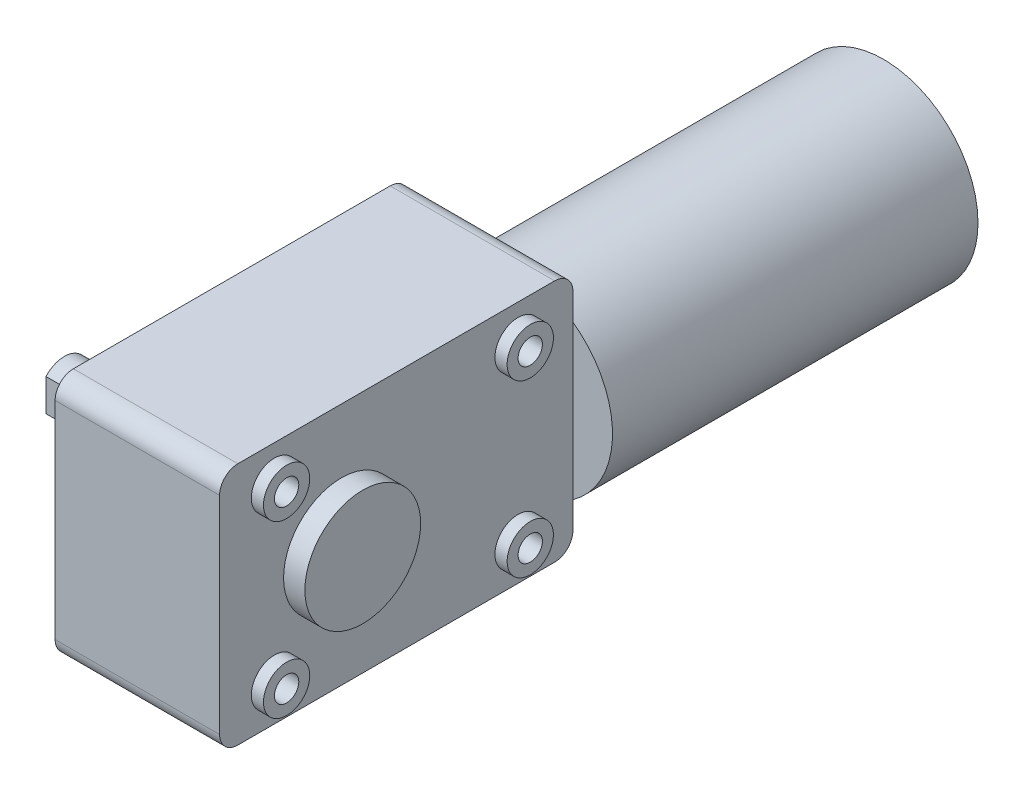
ISO-10303-21;
HEADER;
FILE_DESCRIPTION(('STEP AP214'),'2;1');
FILE_NAME('part.step','',(''),(''),'','','');
FILE_SCHEMA(('AUTOMOTIVE_DESIGN { 1 0 10303 214 1 1 1 1 }'));
ENDSEC;
DATA;
#1=APPLICATION_CONTEXT('core data for automotive mechanical design processes');
#2=APPLICATION_PROTOCOL_DEFINITION('international standard','automotive_design',2000,#1);
#3=PRODUCT_CONTEXT('',#1,'mechanical');
#4=PRODUCT('Part','Part','',(#3));
#5=PRODUCT_RELATED_PRODUCT_CATEGORY('part','',(#4));
#6=PRODUCT_DEFINITION_FORMATION('','',#4);
#7=PRODUCT_DEFINITION_CONTEXT('part definition',#1,'design');
#8=PRODUCT_DEFINITION('design','',#6,#7);
#9=PRODUCT_DEFINITION_SHAPE('','',#8);
#10=(LENGTH_UNIT() NAMED_UNIT(*) SI_UNIT(.MILLI.,.METRE.));
#11=(NAMED_UNIT(*) PLANE_ANGLE_UNIT() SI_UNIT($,.RADIAN.));
#12=(NAMED_UNIT(*) SI_UNIT($,.STERADIAN.) SOLID_ANGLE_UNIT());
#13=UNCERTAINTY_MEASURE_WITH_UNIT(LENGTH_MEASURE(1.E-05),#10,'distance_accuracy_value','');
#14=(GEOMETRIC_REPRESENTATION_CONTEXT(3) GLOBAL_UNCERTAINTY_ASSIGNED_CONTEXT((#13)) GLOBAL_UNIT_ASSIGNED_CONTEXT((#10,
#11,#12)) REPRESENTATION_CONTEXT('',''));
#15=CARTESIAN_POINT('',(0.,0.,0.));
#16=DIRECTION('',(0.,0.,1.));
#17=DIRECTION('',(1.,0.,0.));
#18=AXIS2_PLACEMENT_3D('',#15,#16,#17);
#19=CARTESIAN_POINT('',(11.,-14.,69.));
#20=DIRECTION('',(-1.,0.,0.));
#21=DIRECTION('',(0.,0.,1.));
#22=AXIS2_PLACEMENT_3D('',#19,#20,#21);
#23=PLANE('',#22);
#24=CARTESIAN_POINT('',(11.,-14.,69.));
#25=DIRECTION('',(1.,0.,0.));
#26=DIRECTION('',(0.,0.,1.));
#27=AXIS2_PLACEMENT_3D('',#24,#25,#26);
#28=CIRCLE('',#27,3.8);
#29=CARTESIAN_POINT('',(11.,-14.,72.8));
#30=VERTEX_POINT('',#29);
#31=EDGE_CURVE('E740',#30,#30,#28,.T.);
#32=ORIENTED_EDGE('',*,*,#31,.T.);
#33=EDGE_LOOP('',(#32));
#34=FACE_BOUND('',#33,.T.);
#35=CARTESIAN_POINT('',(11.,-14.,69.));
#36=DIRECTION('',(1.,0.,0.));
#37=DIRECTION('',(0.,0.,-1.));
#38=AXIS2_PLACEMENT_3D('',#35,#36,#37);
#39=CIRCLE('',#38,2.);
#40=CARTESIAN_POINT('',(11.,-14.,67.));
#41=VERTEX_POINT('',#40);
#42=EDGE_CURVE('E721',#41,#41,#39,.T.);
#43=ORIENTED_EDGE('',*,*,#42,.F.);
#44=EDGE_LOOP('',(#43));
#45=FACE_BOUND('',#44,.T.);
#46=ADVANCED_FACE('F50',(#34,#45),#23,.F.);
#47=CARTESIAN_POINT('',(0.,0.,60.));
#48=DIRECTION('',(0.,0.,1.));
#49=DIRECTION('',(1.,0.,0.));
#50=AXIS2_PLACEMENT_3D('',#47,#48,#49);
#51=PLANE('',#50);
#52=CARTESIAN_POINT('',(0.,0.,60.));
#53=DIRECTION('',(0.,0.,1.));
#54=DIRECTION('',(1.,0.,0.));
#55=AXIS2_PLACEMENT_3D('',#52,#53,#54);
#56=CIRCLE('',#55,15.5);
#57=CARTESIAN_POINT('',(9.00000000000001,-12.619429464124,60.));
#58=VERTEX_POINT('',#57);
#59=CARTESIAN_POINT('',(9.00000000000001,12.619429464124,60.));
#60=VERTEX_POINT('',#59);
#61=EDGE_CURVE('E205',#58,#60,#56,.T.);
#62=ORIENTED_EDGE('',*,*,#61,.T.);
#63=DIRECTION('',(0.,-1.,0.));
#64=VECTOR('',#63,1.);
#65=CARTESIAN_POINT('',(9.00000000000001,20.,60.));
#66=LINE('',#65,#64);
#67=EDGE_CURVE('E195',#60,#58,#66,.T.);
#68=ORIENTED_EDGE('',*,*,#67,.T.);
#69=EDGE_LOOP('',(#62,#68));
#70=FACE_BOUND('',#69,.T.);
#71=ADVANCED_FACE('F296',(#70),#51,.T.);
#72=CARTESIAN_POINT('',(0.,0.,60.));
#73=DIRECTION('',(0.,0.,-1.));
#74=DIRECTION('',(-1.,0.,0.));
#75=AXIS2_PLACEMENT_3D('',#72,#73,#74);
#76=CYLINDRICAL_SURFACE('',#75,15.5);
#77=EDGE_CURVE('E202',#60,#58,#56,.T.);
#78=ORIENTED_EDGE('',*,*,#77,.F.);
#79=ORIENTED_EDGE('',*,*,#61,.F.);
#80=EDGE_LOOP('',(#78,#79));
#81=FACE_BOUND('',#80,.T.);
#82=CARTESIAN_POINT('',(0.,0.,0.));
#83=DIRECTION('',(0.,0.,1.));
#84=DIRECTION('',(1.,0.,0.));
#85=AXIS2_PLACEMENT_3D('',#82,#83,#84);
#86=CIRCLE('',#85,15.5);
#87=CARTESIAN_POINT('',(15.5,0.,0.));
#88=VERTEX_POINT('',#87);
#89=EDGE_CURVE('E198',#88,#88,#86,.T.);
#90=ORIENTED_EDGE('',*,*,#89,.T.);
#91=EDGE_LOOP('',(#90));
#92=FACE_BOUND('',#91,.T.);
#93=ADVANCED_FACE('F298',(#81,#92),#76,.T.);
#94=CARTESIAN_POINT('',(0.,0.,0.));
#95=DIRECTION('',(0.,0.,1.));
#96=DIRECTION('',(1.,0.,0.));
#97=AXIS2_PLACEMENT_3D('',#94,#95,#96);
#98=PLANE('',#97);
#99=CARTESIAN_POINT('',(0.,0.,0.));
#100=DIRECTION('',(0.,0.,-1.));
#101=DIRECTION('',(-1.,0.,0.));
#102=AXIS2_PLACEMENT_3D('',#99,#100,#101);
#103=CIRCLE('',#102,6.);
#104=CARTESIAN_POINT('',(-6.,0.,0.));
#105=VERTEX_POINT('',#104);
#106=EDGE_CURVE('E199',#105,#105,#103,.T.);
#107=ORIENTED_EDGE('',*,*,#106,.F.);
#108=EDGE_LOOP('',(#107));
#109=FACE_BOUND('',#108,.T.);
#110=ORIENTED_EDGE('',*,*,#89,.F.);
#111=EDGE_LOOP('',(#110));
#112=FACE_BOUND('',#111,.T.);
#113=ADVANCED_FACE('F301',(#109,#112),#98,.F.);
#114=CARTESIAN_POINT('',(0.,0.,-2.));
#115=DIRECTION('',(0.,0.,1.));
#116=DIRECTION('',(1.,0.,0.));
#117=AXIS2_PLACEMENT_3D('',#114,#115,#116);
#118=CYLINDRICAL_SURFACE('',#117,6.);
#119=CARTESIAN_POINT('',(0.,0.,-2.));
#120=DIRECTION('',(0.,0.,-1.));
#121=DIRECTION('',(-1.,0.,0.));
#122=AXIS2_PLACEMENT_3D('',#119,#120,#121);
#123=CIRCLE('',#122,6.);
#124=CARTESIAN_POINT('',(-6.,0.,-2.));
#125=VERTEX_POINT('',#124);
#126=EDGE_CURVE('E194',#125,#125,#123,.T.);
#127=ORIENTED_EDGE('',*,*,#126,.F.);
#128=EDGE_LOOP('',(#127));
#129=FACE_BOUND('',#128,.T.);
#130=ORIENTED_EDGE('',*,*,#106,.T.);
#131=EDGE_LOOP('',(#130));
#132=FACE_BOUND('',#131,.T.);
#133=ADVANCED_FACE('F306',(#129,#132),#118,.T.);
#134=CARTESIAN_POINT('',(0.,0.,-2.));
#135=DIRECTION('',(0.,0.,-1.));
#136=DIRECTION('',(-1.,0.,0.));
#137=AXIS2_PLACEMENT_3D('',#134,#135,#136);
#138=PLANE('',#137);
#139=ORIENTED_EDGE('',*,*,#126,.T.);
#140=EDGE_LOOP('',(#139));
#141=FACE_BOUND('',#140,.T.);
#142=ADVANCED_FACE('F312',(#141),#138,.T.);
#143=CARTESIAN_POINT('',(9.00000000000001,20.,60.));
#144=DIRECTION('',(0.,0.,1.));
#145=DIRECTION('',(1.,0.,0.));
#146=AXIS2_PLACEMENT_3D('',#143,#144,#145);
#147=PLANE('',#146);
#148=CARTESIAN_POINT('',(9.00000000000001,-17.,60.));
#149=VERTEX_POINT('',#148);
#150=EDGE_CURVE('E191',#58,#149,#66,.T.);
#151=ORIENTED_EDGE('',*,*,#150,.T.);
#152=DIRECTION('',(-1.,0.,0.));
#153=VECTOR('',#152,1.);
#154=CARTESIAN_POINT('',(-18.,-17.,60.));
#155=LINE('',#154,#153);
#156=CARTESIAN_POINT('',(-18.,-17.,60.));
#157=VERTEX_POINT('',#156);
#158=EDGE_CURVE('E234',#149,#157,#155,.T.);
#159=ORIENTED_EDGE('',*,*,#158,.T.);
#160=DIRECTION('',(0.,-1.,0.));
#161=VECTOR('',#160,1.);
#162=CARTESIAN_POINT('',(-18.,20.,60.));
#163=LINE('',#162,#161);
#164=CARTESIAN_POINT('',(-18.,17.,60.));
#165=VERTEX_POINT('',#164);
#166=EDGE_CURVE('E188',#165,#157,#163,.T.);
#167=ORIENTED_EDGE('',*,*,#166,.F.);
#168=DIRECTION('',(-1.,0.,0.));
#169=VECTOR('',#168,1.);
#170=CARTESIAN_POINT('',(9.00000000000001,17.,60.));
#171=LINE('',#170,#169);
#172=CARTESIAN_POINT('',(9.00000000000001,17.,60.));
#173=VERTEX_POINT('',#172);
#174=EDGE_CURVE('E164',#165,#173,#171,.F.);
#175=ORIENTED_EDGE('',*,*,#174,.T.);
#176=EDGE_CURVE('E192',#173,#60,#66,.T.);
#177=ORIENTED_EDGE('',*,*,#176,.T.);
#178=ORIENTED_EDGE('',*,*,#77,.T.);
#179=EDGE_LOOP('',(#151,#159,#167,#175,#177,#178));
#180=FACE_BOUND('',#179,.T.);
#181=ADVANCED_FACE('F280',(#180),#147,.F.);
#182=CARTESIAN_POINT('',(9.00000000000001,20.,60.));
#183=DIRECTION('',(-1.,0.,0.));
#184=DIRECTION('',(0.,0.,1.));
#185=AXIS2_PLACEMENT_3D('',#182,#183,#184);
#186=PLANE('',#185);
#187=CARTESIAN_POINT('',(9.00000000000001,-14.,109.));
#188=DIRECTION('',(-1.,0.,0.));
#189=DIRECTION('',(0.,0.,1.));
#190=AXIS2_PLACEMENT_3D('',#187,#188,#189);
#191=CIRCLE('',#190,3.8);
#192=CARTESIAN_POINT('',(9.00000000000001,-14.,112.8));
#193=VERTEX_POINT('',#192);
#194=EDGE_CURVE('E231',#193,#193,#191,.T.);
#195=ORIENTED_EDGE('',*,*,#194,.T.);
#196=EDGE_LOOP('',(#195));
#197=FACE_BOUND('',#196,.T.);
#198=CARTESIAN_POINT('',(9.00000000000001,-14.,69.));
#199=DIRECTION('',(-1.,0.,0.));
#200=DIRECTION('',(0.,0.,1.));
#201=AXIS2_PLACEMENT_3D('',#198,#199,#200);
#202=CIRCLE('',#201,3.8);
#203=CARTESIAN_POINT('',(9.00000000000001,-14.,72.8));
#204=VERTEX_POINT('',#203);
#205=EDGE_CURVE('E226',#204,#204,#202,.T.);
#206=ORIENTED_EDGE('',*,*,#205,.T.);
#207=EDGE_LOOP('',(#206));
#208=FACE_BOUND('',#207,.T.);
#209=CARTESIAN_POINT('',(9.00000000000001,14.,109.));
#210=DIRECTION('',(-1.,0.,0.));
#211=DIRECTION('',(0.,0.,1.));
#212=AXIS2_PLACEMENT_3D('',#209,#210,#211);
#213=CIRCLE('',#212,3.8);
#214=CARTESIAN_POINT('',(9.00000000000001,14.,112.8));
#215=VERTEX_POINT('',#214);
#216=EDGE_CURVE('E221',#215,#215,#213,.T.);
#217=ORIENTED_EDGE('',*,*,#216,.T.);
#218=EDGE_LOOP('',(#217));
#219=FACE_BOUND('',#218,.T.);
#220=CARTESIAN_POINT('',(9.00000000000001,14.,69.));
#221=DIRECTION('',(-1.,0.,0.));
#222=DIRECTION('',(0.,0.,1.));
#223=AXIS2_PLACEMENT_3D('',#220,#221,#222);
#224=CIRCLE('',#223,3.8);
#225=CARTESIAN_POINT('',(9.00000000000001,14.,72.8));
#226=VERTEX_POINT('',#225);
#227=EDGE_CURVE('E216',#226,#226,#224,.T.);
#228=ORIENTED_EDGE('',*,*,#227,.T.);
#229=EDGE_LOOP('',(#228));
#230=FACE_BOUND('',#229,.T.);
#231=CARTESIAN_POINT('',(9.00000000000001,0.,97.9999999999999));
#232=DIRECTION('',(-1.,0.,0.));
#233=DIRECTION('',(0.,0.,1.));
#234=AXIS2_PLACEMENT_3D('',#231,#232,#233);
#235=CIRCLE('',#234,9.49999999999999);
#236=CARTESIAN_POINT('',(9.00000000000001,0.,107.5));
#237=VERTEX_POINT('',#236);
#238=EDGE_CURVE('E165',#237,#237,#235,.F.);
#239=ORIENTED_EDGE('',*,*,#238,.F.);
#240=EDGE_LOOP('',(#239));
#241=FACE_BOUND('',#240,.T.);
#242=DIRECTION('',(0.,0.,-1.));
#243=VECTOR('',#242,1.);
#244=CARTESIAN_POINT('',(9.00000000000001,-20.,60.));
#245=LINE('',#244,#243);
#246=CARTESIAN_POINT('',(9.00000000000001,-20.,115.));
#247=VERTEX_POINT('',#246);
#248=CARTESIAN_POINT('',(9.00000000000001,-20.,63.));
#249=VERTEX_POINT('',#248);
#250=EDGE_CURVE('E171',#247,#249,#245,.T.);
#251=ORIENTED_EDGE('',*,*,#250,.T.);
#252=CARTESIAN_POINT('',(9.00000000000001,-17.,63.));
#253=DIRECTION('',(-1.,0.,0.));
#254=DIRECTION('',(0.,0.,1.));
#255=AXIS2_PLACEMENT_3D('',#252,#253,#254);
#256=CIRCLE('',#255,3.);
#257=EDGE_CURVE('E253',#249,#149,#256,.F.);
#258=ORIENTED_EDGE('',*,*,#257,.T.);
#259=ORIENTED_EDGE('',*,*,#150,.F.);
#260=ORIENTED_EDGE('',*,*,#67,.F.);
#261=ORIENTED_EDGE('',*,*,#176,.F.);
#262=CARTESIAN_POINT('',(9.00000000000001,17.,63.));
#263=DIRECTION('',(-1.,0.,0.));
#264=DIRECTION('',(0.,0.,1.));
#265=AXIS2_PLACEMENT_3D('',#262,#263,#264);
#266=CIRCLE('',#265,3.);
#267=CARTESIAN_POINT('',(9.00000000000001,20.,63.));
#268=VERTEX_POINT('',#267);
#269=EDGE_CURVE('E249',#173,#268,#266,.F.);
#270=ORIENTED_EDGE('',*,*,#269,.T.);
#271=DIRECTION('',(0.,0.,-1.));
#272=VECTOR('',#271,1.);
#273=CARTESIAN_POINT('',(9.00000000000001,20.,60.));
#274=LINE('',#273,#272);
#275=CARTESIAN_POINT('',(9.00000000000001,20.,115.));
#276=VERTEX_POINT('',#275);
#277=EDGE_CURVE('E172',#276,#268,#274,.T.);
#278=ORIENTED_EDGE('',*,*,#277,.F.);
#279=CARTESIAN_POINT('',(9.00000000000001,17.,115.));
#280=DIRECTION('',(-1.,0.,0.));
#281=DIRECTION('',(0.,0.,1.));
#282=AXIS2_PLACEMENT_3D('',#279,#280,#281);
#283=CIRCLE('',#282,3.);
#284=CARTESIAN_POINT('',(9.00000000000001,17.,118.));
#285=VERTEX_POINT('',#284);
#286=EDGE_CURVE('E73',#276,#285,#283,.F.);
#287=ORIENTED_EDGE('',*,*,#286,.T.);
#288=DIRECTION('',(0.,-1.,0.));
#289=VECTOR('',#288,1.);
#290=CARTESIAN_POINT('',(9.00000000000001,20.,118.));
#291=LINE('',#290,#289);
#292=CARTESIAN_POINT('',(9.00000000000001,-17.,118.));
#293=VERTEX_POINT('',#292);
#294=EDGE_CURVE('E179',#285,#293,#291,.T.);
#295=ORIENTED_EDGE('',*,*,#294,.T.);
#296=CARTESIAN_POINT('',(9.00000000000001,-17.,115.));
#297=DIRECTION('',(-1.,0.,0.));
#298=DIRECTION('',(0.,0.,1.));
#299=AXIS2_PLACEMENT_3D('',#296,#297,#298);
#300=CIRCLE('',#299,3.);
#301=EDGE_CURVE('E65',#293,#247,#300,.F.);
#302=ORIENTED_EDGE('',*,*,#301,.T.);
#303=EDGE_LOOP('',(#251,#258,#259,#260,#261,#270,#278,#287,#295,#302));
#304=FACE_BOUND('',#303,.T.);
#305=ADVANCED_FACE('F274',(#197,#208,#219,#230,#241,#304),#186,.F.);
#306=CARTESIAN_POINT('',(-18.,20.,60.));
#307=DIRECTION('',(1.,0.,0.));
#308=DIRECTION('',(0.,0.,-1.));
#309=AXIS2_PLACEMENT_3D('',#306,#307,#308);
#310=PLANE('',#309);
#311=CARTESIAN_POINT('',(-18.,-14.,109.));
#312=DIRECTION('',(1.,0.,0.));
#313=DIRECTION('',(0.,0.,-1.));
#314=AXIS2_PLACEMENT_3D('',#311,#312,#313);
#315=CIRCLE('',#314,3.8);
#316=CARTESIAN_POINT('',(-18.,-14.,105.2));
#317=VERTEX_POINT('',#316);
#318=EDGE_CURVE('E228',#317,#317,#315,.T.);
#319=ORIENTED_EDGE('',*,*,#318,.T.);
#320=EDGE_LOOP('',(#319));
#321=FACE_BOUND('',#320,.T.);
#322=CARTESIAN_POINT('',(-18.,-14.,69.));
#323=DIRECTION('',(1.,0.,0.));
#324=DIRECTION('',(0.,0.,-1.));
#325=AXIS2_PLACEMENT_3D('',#322,#323,#324);
#326=CIRCLE('',#325,3.8);
#327=CARTESIAN_POINT('',(-18.,-14.,65.2));
#328=VERTEX_POINT('',#327);
#329=EDGE_CURVE('E223',#328,#328,#326,.T.);
#330=ORIENTED_EDGE('',*,*,#329,.T.);
#331=EDGE_LOOP('',(#330));
#332=FACE_BOUND('',#331,.T.);
#333=CARTESIAN_POINT('',(-18.,14.,109.));
#334=DIRECTION('',(1.,0.,0.));
#335=DIRECTION('',(0.,0.,-1.));
#336=AXIS2_PLACEMENT_3D('',#333,#334,#335);
#337=CIRCLE('',#336,3.8);
#338=CARTESIAN_POINT('',(-18.,14.,105.2));
#339=VERTEX_POINT('',#338);
#340=EDGE_CURVE('E218',#339,#339,#337,.T.);
#341=ORIENTED_EDGE('',*,*,#340,.T.);
#342=EDGE_LOOP('',(#341));
#343=FACE_BOUND('',#342,.T.);
#344=CARTESIAN_POINT('',(-18.,14.,69.));
#345=DIRECTION('',(1.,0.,0.));
#346=DIRECTION('',(0.,0.,-1.));
#347=AXIS2_PLACEMENT_3D('',#344,#345,#346);
#348=CIRCLE('',#347,3.8);
#349=CARTESIAN_POINT('',(-18.,14.,65.2));
#350=VERTEX_POINT('',#349);
#351=EDGE_CURVE('E213',#350,#350,#348,.T.);
#352=ORIENTED_EDGE('',*,*,#351,.T.);
#353=EDGE_LOOP('',(#352));
#354=FACE_BOUND('',#353,.T.);
#355=CARTESIAN_POINT('',(-18.,0.,98.));
#356=DIRECTION('',(1.,0.,0.));
#357=DIRECTION('',(0.,0.,-1.));
#358=AXIS2_PLACEMENT_3D('',#355,#356,#357);
#359=CIRCLE('',#358,9.49999999999999);
#360=CARTESIAN_POINT('',(-18.,0.,88.5));
#361=VERTEX_POINT('',#360);
#362=EDGE_CURVE('E208',#361,#361,#359,.F.);
#363=ORIENTED_EDGE('',*,*,#362,.F.);
#364=EDGE_LOOP('',(#363));
#365=FACE_BOUND('',#364,.T.);
#366=ORIENTED_EDGE('',*,*,#166,.T.);
#367=CARTESIAN_POINT('',(-18.,-17.,63.));
#368=DIRECTION('',(1.,0.,0.));
#369=DIRECTION('',(0.,0.,-1.));
#370=AXIS2_PLACEMENT_3D('',#367,#368,#369);
#371=CIRCLE('',#370,3.);
#372=CARTESIAN_POINT('',(-18.,-20.,63.));
#373=VERTEX_POINT('',#372);
#374=EDGE_CURVE('E243',#157,#373,#371,.F.);
#375=ORIENTED_EDGE('',*,*,#374,.T.);
#376=DIRECTION('',(0.,0.,1.));
#377=VECTOR('',#376,1.);
#378=CARTESIAN_POINT('',(-18.,-20.,60.));
#379=LINE('',#378,#377);
#380=CARTESIAN_POINT('',(-18.,-20.,115.));
#381=VERTEX_POINT('',#380);
#382=EDGE_CURVE('E176',#373,#381,#379,.T.);
#383=ORIENTED_EDGE('',*,*,#382,.T.);
#384=CARTESIAN_POINT('',(-18.,-17.,115.));
#385=DIRECTION('',(1.,0.,0.));
#386=DIRECTION('',(0.,0.,-1.));
#387=AXIS2_PLACEMENT_3D('',#384,#385,#386);
#388=CIRCLE('',#387,3.);
#389=CARTESIAN_POINT('',(-18.,-17.,118.));
#390=VERTEX_POINT('',#389);
#391=EDGE_CURVE('E241',#381,#390,#388,.F.);
#392=ORIENTED_EDGE('',*,*,#391,.T.);
#393=DIRECTION('',(0.,-1.,0.));
#394=VECTOR('',#393,1.);
#395=CARTESIAN_POINT('',(-18.,20.,118.));
#396=LINE('',#395,#394);
#397=CARTESIAN_POINT('',(-18.,17.,118.));
#398=VERTEX_POINT('',#397);
#399=EDGE_CURVE('E185',#398,#390,#396,.T.);
#400=ORIENTED_EDGE('',*,*,#399,.F.);
#401=CARTESIAN_POINT('',(-18.,17.,115.));
#402=DIRECTION('',(1.,0.,0.));
#403=DIRECTION('',(0.,0.,-1.));
#404=AXIS2_PLACEMENT_3D('',#401,#402,#403);
#405=CIRCLE('',#404,3.);
#406=CARTESIAN_POINT('',(-18.,20.,115.));
#407=VERTEX_POINT('',#406);
#408=EDGE_CURVE('E239',#398,#407,#405,.F.);
#409=ORIENTED_EDGE('',*,*,#408,.T.);
#410=DIRECTION('',(0.,0.,1.));
#411=VECTOR('',#410,1.);
#412=CARTESIAN_POINT('',(-18.,20.,60.));
#413=LINE('',#412,#411);
#414=CARTESIAN_POINT('',(-18.,20.,63.));
#415=VERTEX_POINT('',#414);
#416=EDGE_CURVE('E175',#415,#407,#413,.T.);
#417=ORIENTED_EDGE('',*,*,#416,.F.);
#418=CARTESIAN_POINT('',(-18.,17.,63.));
#419=DIRECTION('',(1.,0.,0.));
#420=DIRECTION('',(0.,0.,-1.));
#421=AXIS2_PLACEMENT_3D('',#418,#419,#420);
#422=CIRCLE('',#421,3.);
#423=EDGE_CURVE('E237',#415,#165,#422,.F.);
#424=ORIENTED_EDGE('',*,*,#423,.T.);
#425=EDGE_LOOP('',(#366,#375,#383,#392,#400,#409,#417,#424));
#426=FACE_BOUND('',#425,.T.);
#427=ADVANCED_FACE('F267',(#321,#332,#343,#354,#365,#426),#310,.F.);
#428=CARTESIAN_POINT('',(9.00000000000001,20.,118.));
#429=DIRECTION('',(0.,0.,-1.));
#430=DIRECTION('',(-1.,0.,0.));
#431=AXIS2_PLACEMENT_3D('',#428,#429,#430);
#432=PLANE('',#431);
#433=ORIENTED_EDGE('',*,*,#399,.T.);
#434=DIRECTION('',(1.,0.,0.));
#435=VECTOR('',#434,1.);
#436=CARTESIAN_POINT('',(9.00000000000001,-17.,118.));
#437=LINE('',#436,#435);
#438=EDGE_CURVE('E257',#390,#293,#437,.T.);
#439=ORIENTED_EDGE('',*,*,#438,.T.);
#440=ORIENTED_EDGE('',*,*,#294,.F.);
#441=DIRECTION('',(1.,0.,0.));
#442=VECTOR('',#441,1.);
#443=CARTESIAN_POINT('',(9.00000000000001,17.,118.));
#444=LINE('',#443,#442);
#445=EDGE_CURVE('E255',#285,#398,#444,.F.);
#446=ORIENTED_EDGE('',*,*,#445,.T.);
#447=EDGE_LOOP('',(#433,#439,#440,#446));
#448=FACE_BOUND('',#447,.T.);
#449=ADVANCED_FACE('F393',(#448),#432,.F.);
#450=CARTESIAN_POINT('',(0.,20.,0.));
#451=DIRECTION('',(0.,-1.,0.));
#452=DIRECTION('',(0.,0.,-1.));
#453=AXIS2_PLACEMENT_3D('',#450,#451,#452);
#454=PLANE('',#453);
#455=ORIENTED_EDGE('',*,*,#416,.T.);
#456=DIRECTION('',(1.,0.,0.));
#457=VECTOR('',#456,1.);
#458=CARTESIAN_POINT('',(1.18218192436938E-13,20.,115.));
#459=LINE('',#458,#457);
#460=EDGE_CURVE('E14',#407,#276,#459,.T.);
#461=ORIENTED_EDGE('',*,*,#460,.T.);
#462=ORIENTED_EDGE('',*,*,#277,.T.);
#463=DIRECTION('',(-1.,0.,0.));
#464=VECTOR('',#463,1.);
#465=CARTESIAN_POINT('',(0.,20.,63.));
#466=LINE('',#465,#464);
#467=EDGE_CURVE('E58',#268,#415,#466,.T.);
#468=ORIENTED_EDGE('',*,*,#467,.T.);
#469=EDGE_LOOP('',(#455,#461,#462,#468));
#470=FACE_BOUND('',#469,.T.);
#471=ADVANCED_FACE('F262',(#470),#454,.F.);
#472=CARTESIAN_POINT('',(0.,-20.,0.));
#473=DIRECTION('',(0.,-1.,0.));
#474=DIRECTION('',(0.,0.,-1.));
#475=AXIS2_PLACEMENT_3D('',#472,#473,#474);
#476=PLANE('',#475);
#477=ORIENTED_EDGE('',*,*,#382,.F.);
#478=DIRECTION('',(-1.,0.,0.));
#479=VECTOR('',#478,1.);
#480=CARTESIAN_POINT('',(9.00000000000001,-20.,63.));
#481=LINE('',#480,#479);
#482=EDGE_CURVE('E247',#373,#249,#481,.F.);
#483=ORIENTED_EDGE('',*,*,#482,.T.);
#484=ORIENTED_EDGE('',*,*,#250,.F.);
#485=DIRECTION('',(1.,0.,0.));
#486=VECTOR('',#485,1.);
#487=CARTESIAN_POINT('',(-18.,-20.,115.));
#488=LINE('',#487,#486);
#489=EDGE_CURVE('E245',#247,#381,#488,.F.);
#490=ORIENTED_EDGE('',*,*,#489,.T.);
#491=EDGE_LOOP('',(#477,#483,#484,#490));
#492=FACE_BOUND('',#491,.T.);
#493=ADVANCED_FACE('F287',(#492),#476,.T.);
#494=CARTESIAN_POINT('',(-21.5,0.,98.));
#495=DIRECTION('',(1.,0.,0.));
#496=DIRECTION('',(0.,0.,-1.));
#497=AXIS2_PLACEMENT_3D('',#494,#495,#496);
#498=CYLINDRICAL_SURFACE('',#497,9.49999999999999);
#499=CARTESIAN_POINT('',(-21.5,0.,98.));
#500=DIRECTION('',(-1.,0.,0.));
#501=DIRECTION('',(0.,0.,1.));
#502=AXIS2_PLACEMENT_3D('',#499,#500,#501);
#503=CIRCLE('',#502,9.49999999999999);
#504=CARTESIAN_POINT('',(-21.5,0.,107.5));
#505=VERTEX_POINT('',#504);
#506=EDGE_CURVE('E168',#505,#505,#503,.T.);
#507=ORIENTED_EDGE('',*,*,#506,.F.);
#508=EDGE_LOOP('',(#507));
#509=FACE_BOUND('',#508,.T.);
#510=ORIENTED_EDGE('',*,*,#362,.T.);
#511=EDGE_LOOP('',(#510));
#512=FACE_BOUND('',#511,.T.);
#513=ADVANCED_FACE('F386',(#509,#512),#498,.T.);
#514=CARTESIAN_POINT('',(-21.5,0.,98.));
#515=DIRECTION('',(-1.,0.,0.));
#516=DIRECTION('',(0.,0.,1.));
#517=AXIS2_PLACEMENT_3D('',#514,#515,#516);
#518=PLANE('',#517);
#519=CARTESIAN_POINT('',(-21.5,0.,98.));
#520=DIRECTION('',(-1.,0.,0.));
#521=DIRECTION('',(0.,0.,1.));
#522=AXIS2_PLACEMENT_3D('',#519,#520,#521);
#523=CIRCLE('',#522,4.00000000000001);
#524=CARTESIAN_POINT('',(-21.5,0.,102.));
#525=VERTEX_POINT('',#524);
#526=EDGE_CURVE('E161',#525,#525,#523,.T.);
#527=ORIENTED_EDGE('',*,*,#526,.F.);
#528=EDGE_LOOP('',(#527));
#529=FACE_BOUND('',#528,.T.);
#530=ORIENTED_EDGE('',*,*,#506,.T.);
#531=EDGE_LOOP('',(#530));
#532=FACE_BOUND('',#531,.T.);
#533=ADVANCED_FACE('F382',(#529,#532),#518,.T.);
#534=CARTESIAN_POINT('',(12.5,0.,97.9999999999999));
#535=DIRECTION('',(-1.,0.,0.));
#536=DIRECTION('',(0.,0.,1.));
#537=AXIS2_PLACEMENT_3D('',#534,#535,#536);
#538=CYLINDRICAL_SURFACE('',#537,9.49999999999999);
#539=CARTESIAN_POINT('',(12.5,0.,97.9999999999999));
#540=DIRECTION('',(1.,0.,0.));
#541=DIRECTION('',(0.,0.,-1.));
#542=AXIS2_PLACEMENT_3D('',#539,#540,#541);
#543=CIRCLE('',#542,9.49999999999999);
#544=CARTESIAN_POINT('',(12.5,0.,88.5));
#545=VERTEX_POINT('',#544);
#546=EDGE_CURVE('E160',#545,#545,#543,.T.);
#547=ORIENTED_EDGE('',*,*,#546,.F.);
#548=EDGE_LOOP('',(#547));
#549=FACE_BOUND('',#548,.T.);
#550=ORIENTED_EDGE('',*,*,#238,.T.);
#551=EDGE_LOOP('',(#550));
#552=FACE_BOUND('',#551,.T.);
#553=ADVANCED_FACE('F378',(#549,#552),#538,.T.);
#554=CARTESIAN_POINT('',(12.5,0.,97.9999999999999));
#555=DIRECTION('',(1.,0.,0.));
#556=DIRECTION('',(0.,0.,-1.));
#557=AXIS2_PLACEMENT_3D('',#554,#555,#556);
#558=PLANE('',#557);
#559=ORIENTED_EDGE('',*,*,#546,.T.);
#560=EDGE_LOOP('',(#559));
#561=FACE_BOUND('',#560,.T.);
#562=ADVANCED_FACE('F375',(#561),#558,.T.);
#563=CARTESIAN_POINT('',(-36.5,0.,98.));
#564=DIRECTION('',(1.,0.,0.));
#565=DIRECTION('',(0.,0.,-1.));
#566=AXIS2_PLACEMENT_3D('',#563,#564,#565);
#567=CYLINDRICAL_SURFACE('',#566,4.00000000000001);
#568=CARTESIAN_POINT('',(-36.5,0.,98.));
#569=DIRECTION('',(-1.,0.,0.));
#570=DIRECTION('',(0.,0.,1.));
#571=AXIS2_PLACEMENT_3D('',#568,#569,#570);
#572=CIRCLE('',#571,4.00000000000001);
#573=CARTESIAN_POINT('',(-36.5,2.6457513110646,101.));
#574=VERTEX_POINT('',#573);
#575=CARTESIAN_POINT('',(-36.5,-2.64575131106459,101.));
#576=VERTEX_POINT('',#575);
#577=EDGE_CURVE('E154',#574,#576,#572,.T.);
#578=ORIENTED_EDGE('',*,*,#577,.F.);
#579=DIRECTION('',(-1.,0.,0.));
#580=VECTOR('',#579,1.);
#581=CARTESIAN_POINT('',(-22.5,2.6457513110646,101.));
#582=LINE('',#581,#580);
#583=CARTESIAN_POINT('',(-22.5,2.6457513110646,101.));
#584=VERTEX_POINT('',#583);
#585=EDGE_CURVE('E146',#584,#574,#582,.T.);
#586=ORIENTED_EDGE('',*,*,#585,.F.);
#587=CARTESIAN_POINT('',(-22.5,0.,98.));
#588=DIRECTION('',(-1.,0.,0.));
#589=DIRECTION('',(0.,0.,1.));
#590=AXIS2_PLACEMENT_3D('',#587,#588,#589);
#591=CIRCLE('',#590,4.);
#592=CARTESIAN_POINT('',(-22.5,-2.64575131106459,101.));
#593=VERTEX_POINT('',#592);
#594=EDGE_CURVE('E135',#593,#584,#591,.T.);
#595=ORIENTED_EDGE('',*,*,#594,.F.);
#596=DIRECTION('',(-1.,0.,0.));
#597=VECTOR('',#596,1.);
#598=CARTESIAN_POINT('',(-22.5,-2.64575131106459,101.));
#599=LINE('',#598,#597);
#600=EDGE_CURVE('E148',#593,#576,#599,.T.);
#601=ORIENTED_EDGE('',*,*,#600,.T.);
#602=EDGE_LOOP('',(#578,#586,#595,#601));
#603=FACE_BOUND('',#602,.T.);
#604=ORIENTED_EDGE('',*,*,#526,.T.);
#605=EDGE_LOOP('',(#604));
#606=FACE_BOUND('',#605,.T.);
#607=ADVANCED_FACE('F151',(#603,#606),#567,.T.);
#608=CARTESIAN_POINT('',(-36.5,0.,98.));
#609=DIRECTION('',(-1.,0.,0.));
#610=DIRECTION('',(0.,0.,1.));
#611=AXIS2_PLACEMENT_3D('',#608,#609,#610);
#612=PLANE('',#611);
#613=DIRECTION('',(0.,-1.,0.));
#614=VECTOR('',#613,1.);
#615=CARTESIAN_POINT('',(-36.5,2.6457513110646,101.));
#616=LINE('',#615,#614);
#617=EDGE_CURVE('E142',#574,#576,#616,.T.);
#618=ORIENTED_EDGE('',*,*,#617,.F.);
#619=ORIENTED_EDGE('',*,*,#577,.T.);
#620=EDGE_LOOP('',(#618,#619));
#621=FACE_BOUND('',#620,.T.);
#622=ADVANCED_FACE('F369',(#621),#612,.T.);
#623=CARTESIAN_POINT('',(-22.5,2.6457513110646,101.));
#624=DIRECTION('',(0.,0.,-1.));
#625=DIRECTION('',(-1.,0.,0.));
#626=AXIS2_PLACEMENT_3D('',#623,#624,#625);
#627=PLANE('',#626);
#628=ORIENTED_EDGE('',*,*,#617,.T.);
#629=ORIENTED_EDGE('',*,*,#600,.F.);
#630=DIRECTION('',(0.,-1.,0.));
#631=VECTOR('',#630,1.);
#632=CARTESIAN_POINT('',(-22.5,2.6457513110646,101.));
#633=LINE('',#632,#631);
#634=EDGE_CURVE('E138',#584,#593,#633,.T.);
#635=ORIENTED_EDGE('',*,*,#634,.F.);
#636=ORIENTED_EDGE('',*,*,#585,.T.);
#637=EDGE_LOOP('',(#628,#629,#635,#636));
#638=FACE_BOUND('',#637,.T.);
#639=ADVANCED_FACE('F145',(#638),#627,.F.);
#640=CARTESIAN_POINT('',(-22.5,0.,98.));
#641=DIRECTION('',(-1.,0.,0.));
#642=DIRECTION('',(0.,0.,1.));
#643=AXIS2_PLACEMENT_3D('',#640,#641,#642);
#644=PLANE('',#643);
#645=ORIENTED_EDGE('',*,*,#594,.T.);
#646=ORIENTED_EDGE('',*,*,#634,.T.);
#647=EDGE_LOOP('',(#645,#646));
#648=FACE_BOUND('',#647,.T.);
#649=ADVANCED_FACE('F137',(#648),#644,.T.);
#650=CARTESIAN_POINT('',(-20.,20.,60.));
#651=DIRECTION('',(1.,0.,0.));
#652=DIRECTION('',(0.,0.,-1.));
#653=AXIS2_PLACEMENT_3D('',#650,#651,#652);
#654=PLANE('',#653);
#655=CARTESIAN_POINT('',(-20.,14.,69.));
#656=DIRECTION('',(1.,0.,0.));
#657=DIRECTION('',(0.,0.,-1.));
#658=AXIS2_PLACEMENT_3D('',#655,#656,#657);
#659=CIRCLE('',#658,2.);
#660=CARTESIAN_POINT('',(-20.,14.,67.));
#661=VERTEX_POINT('',#660);
#662=EDGE_CURVE('E715',#661,#661,#659,.T.);
#663=ORIENTED_EDGE('',*,*,#662,.T.);
#664=EDGE_LOOP('',(#663));
#665=FACE_BOUND('',#664,.T.);
#666=CARTESIAN_POINT('',(-20.,14.,69.));
#667=DIRECTION('',(1.,0.,0.));
#668=DIRECTION('',(0.,0.,-1.));
#669=AXIS2_PLACEMENT_3D('',#666,#667,#668);
#670=CIRCLE('',#669,3.8);
#671=CARTESIAN_POINT('',(-20.,14.,65.2));
#672=VERTEX_POINT('',#671);
#673=EDGE_CURVE('E217',#672,#672,#670,.F.);
#674=ORIENTED_EDGE('',*,*,#673,.T.);
#675=EDGE_LOOP('',(#674));
#676=FACE_BOUND('',#675,.T.);
#677=ADVANCED_FACE('F357',(#665,#676),#654,.F.);
#678=CARTESIAN_POINT('',(-32.7480230740355,14.,69.));
#679=DIRECTION('',(1.,0.,0.));
#680=DIRECTION('',(0.,0.,-1.));
#681=AXIS2_PLACEMENT_3D('',#678,#679,#680);
#682=CYLINDRICAL_SURFACE('',#681,3.8);
#683=ORIENTED_EDGE('',*,*,#673,.F.);
#684=EDGE_LOOP('',(#683));
#685=FACE_BOUND('',#684,.T.);
#686=ORIENTED_EDGE('',*,*,#351,.F.);
#687=EDGE_LOOP('',(#686));
#688=FACE_BOUND('',#687,.T.);
#689=ADVANCED_FACE('F360',(#685,#688),#682,.T.);
#690=CARTESIAN_POINT('',(11.,14.,69.));
#691=DIRECTION('',(1.,0.,0.));
#692=DIRECTION('',(0.,0.,-1.));
#693=AXIS2_PLACEMENT_3D('',#690,#691,#692);
#694=CIRCLE('',#693,3.8);
#695=CARTESIAN_POINT('',(11.,14.,65.2));
#696=VERTEX_POINT('',#695);
#697=EDGE_CURVE('E753',#696,#696,#694,.T.);
#698=ORIENTED_EDGE('',*,*,#697,.F.);
#699=EDGE_LOOP('',(#698));
#700=FACE_BOUND('',#699,.T.);
#701=ORIENTED_EDGE('',*,*,#227,.F.);
#702=EDGE_LOOP('',(#701));
#703=FACE_BOUND('',#702,.T.);
#704=ADVANCED_FACE('F355',(#700,#703),#682,.T.);
#705=CARTESIAN_POINT('',(11.,14.,69.));
#706=DIRECTION('',(1.,0.,0.));
#707=DIRECTION('',(0.,0.,-1.));
#708=AXIS2_PLACEMENT_3D('',#705,#706,#707);
#709=PLANE('',#708);
#710=CARTESIAN_POINT('',(11.,14.,69.));
#711=DIRECTION('',(1.,0.,0.));
#712=DIRECTION('',(0.,0.,-1.));
#713=AXIS2_PLACEMENT_3D('',#710,#711,#712);
#714=CIRCLE('',#713,2.);
#715=CARTESIAN_POINT('',(11.,14.,67.));
#716=VERTEX_POINT('',#715);
#717=EDGE_CURVE('E712',#716,#716,#714,.T.);
#718=ORIENTED_EDGE('',*,*,#717,.F.);
#719=EDGE_LOOP('',(#718));
#720=FACE_BOUND('',#719,.T.);
#721=ORIENTED_EDGE('',*,*,#697,.T.);
#722=EDGE_LOOP('',(#721));
#723=FACE_BOUND('',#722,.T.);
#724=ADVANCED_FACE('F348',(#720,#723),#709,.T.);
#725=CARTESIAN_POINT('',(-20.,20.,60.));
#726=DIRECTION('',(1.,0.,0.));
#727=DIRECTION('',(0.,0.,-1.));
#728=AXIS2_PLACEMENT_3D('',#725,#726,#727);
#729=PLANE('',#728);
#730=CARTESIAN_POINT('',(-20.,14.,109.));
#731=DIRECTION('',(1.,0.,0.));
#732=DIRECTION('',(0.,0.,-1.));
#733=AXIS2_PLACEMENT_3D('',#730,#731,#732);
#734=CIRCLE('',#733,2.);
#735=CARTESIAN_POINT('',(-20.,14.,107.));
#736=VERTEX_POINT('',#735);
#737=EDGE_CURVE('E711',#736,#736,#734,.T.);
#738=ORIENTED_EDGE('',*,*,#737,.T.);
#739=EDGE_LOOP('',(#738));
#740=FACE_BOUND('',#739,.T.);
#741=CARTESIAN_POINT('',(-20.,14.,109.));
#742=DIRECTION('',(1.,0.,0.));
#743=DIRECTION('',(0.,0.,-1.));
#744=AXIS2_PLACEMENT_3D('',#741,#742,#743);
#745=CIRCLE('',#744,3.8);
#746=CARTESIAN_POINT('',(-20.,14.,105.2));
#747=VERTEX_POINT('',#746);
#748=EDGE_CURVE('E222',#747,#747,#745,.F.);
#749=ORIENTED_EDGE('',*,*,#748,.T.);
#750=EDGE_LOOP('',(#749));
#751=FACE_BOUND('',#750,.T.);
#752=ADVANCED_FACE('F344',(#740,#751),#729,.F.);
#753=CARTESIAN_POINT('',(-32.7480230740355,14.,109.));
#754=DIRECTION('',(1.,0.,0.));
#755=DIRECTION('',(0.,0.,-1.));
#756=AXIS2_PLACEMENT_3D('',#753,#754,#755);
#757=CYLINDRICAL_SURFACE('',#756,3.8);
#758=ORIENTED_EDGE('',*,*,#748,.F.);
#759=EDGE_LOOP('',(#758));
#760=FACE_BOUND('',#759,.T.);
#761=ORIENTED_EDGE('',*,*,#340,.F.);
#762=EDGE_LOOP('',(#761));
#763=FACE_BOUND('',#762,.T.);
#764=ADVANCED_FACE('F347',(#760,#763),#757,.T.);
#765=CARTESIAN_POINT('',(11.,14.,109.));
#766=DIRECTION('',(1.,0.,0.));
#767=DIRECTION('',(0.,0.,1.));
#768=AXIS2_PLACEMENT_3D('',#765,#766,#767);
#769=CIRCLE('',#768,3.8);
#770=CARTESIAN_POINT('',(11.,14.,112.8));
#771=VERTEX_POINT('',#770);
#772=EDGE_CURVE('E746',#771,#771,#769,.T.);
#773=ORIENTED_EDGE('',*,*,#772,.F.);
#774=EDGE_LOOP('',(#773));
#775=FACE_BOUND('',#774,.T.);
#776=ORIENTED_EDGE('',*,*,#216,.F.);
#777=EDGE_LOOP('',(#776));
#778=FACE_BOUND('',#777,.T.);
#779=ADVANCED_FACE('F342',(#775,#778),#757,.T.);
#780=CARTESIAN_POINT('',(11.,14.,109.));
#781=DIRECTION('',(-1.,0.,0.));
#782=DIRECTION('',(0.,0.,1.));
#783=AXIS2_PLACEMENT_3D('',#780,#781,#782);
#784=PLANE('',#783);
#785=CARTESIAN_POINT('',(11.,14.,109.));
#786=DIRECTION('',(1.,0.,0.));
#787=DIRECTION('',(0.,0.,-1.));
#788=AXIS2_PLACEMENT_3D('',#785,#786,#787);
#789=CIRCLE('',#788,2.);
#790=CARTESIAN_POINT('',(11.,14.,107.));
#791=VERTEX_POINT('',#790);
#792=EDGE_CURVE('E708',#791,#791,#789,.T.);
#793=ORIENTED_EDGE('',*,*,#792,.F.);
#794=EDGE_LOOP('',(#793));
#795=FACE_BOUND('',#794,.T.);
#796=ORIENTED_EDGE('',*,*,#772,.T.);
#797=EDGE_LOOP('',(#796));
#798=FACE_BOUND('',#797,.T.);
#799=ADVANCED_FACE('F333',(#795,#798),#784,.F.);
#800=CARTESIAN_POINT('',(-20.,20.,60.));
#801=DIRECTION('',(1.,0.,0.));
#802=DIRECTION('',(0.,0.,-1.));
#803=AXIS2_PLACEMENT_3D('',#800,#801,#802);
#804=PLANE('',#803);
#805=CARTESIAN_POINT('',(-20.,-14.,69.));
#806=DIRECTION('',(1.,0.,0.));
#807=DIRECTION('',(0.,0.,-1.));
#808=AXIS2_PLACEMENT_3D('',#805,#806,#807);
#809=CIRCLE('',#808,2.);
#810=CARTESIAN_POINT('',(-20.,-14.,67.));
#811=VERTEX_POINT('',#810);
#812=EDGE_CURVE('E724',#811,#811,#809,.T.);
#813=ORIENTED_EDGE('',*,*,#812,.T.);
#814=EDGE_LOOP('',(#813));
#815=FACE_BOUND('',#814,.T.);
#816=CARTESIAN_POINT('',(-20.,-14.,69.));
#817=DIRECTION('',(1.,0.,0.));
#818=DIRECTION('',(0.,0.,-1.));
#819=AXIS2_PLACEMENT_3D('',#816,#817,#818);
#820=CIRCLE('',#819,3.8);
#821=CARTESIAN_POINT('',(-20.,-14.,65.2));
#822=VERTEX_POINT('',#821);
#823=EDGE_CURVE('E227',#822,#822,#820,.F.);
#824=ORIENTED_EDGE('',*,*,#823,.T.);
#825=EDGE_LOOP('',(#824));
#826=FACE_BOUND('',#825,.T.);
#827=ADVANCED_FACE('F329',(#815,#826),#804,.F.);
#828=CARTESIAN_POINT('',(-32.7480230740355,-14.,69.));
#829=DIRECTION('',(1.,0.,0.));
#830=DIRECTION('',(0.,0.,-1.));
#831=AXIS2_PLACEMENT_3D('',#828,#829,#830);
#832=CYLINDRICAL_SURFACE('',#831,3.8);
#833=ORIENTED_EDGE('',*,*,#823,.F.);
#834=EDGE_LOOP('',(#833));
#835=FACE_BOUND('',#834,.T.);
#836=ORIENTED_EDGE('',*,*,#329,.F.);
#837=EDGE_LOOP('',(#836));
#838=FACE_BOUND('',#837,.T.);
#839=ADVANCED_FACE('F332',(#835,#838),#832,.T.);
#840=ORIENTED_EDGE('',*,*,#31,.F.);
#841=EDGE_LOOP('',(#840));
#842=FACE_BOUND('',#841,.T.);
#843=ORIENTED_EDGE('',*,*,#205,.F.);
#844=EDGE_LOOP('',(#843));
#845=FACE_BOUND('',#844,.T.);
#846=ADVANCED_FACE('F335',(#842,#845),#832,.T.);
#847=CARTESIAN_POINT('',(-20.,20.,60.));
#848=DIRECTION('',(1.,0.,0.));
#849=DIRECTION('',(0.,0.,-1.));
#850=AXIS2_PLACEMENT_3D('',#847,#848,#849);
#851=PLANE('',#850);
#852=CARTESIAN_POINT('',(-20.,-14.,109.));
#853=DIRECTION('',(1.,0.,0.));
#854=DIRECTION('',(0.,0.,-1.));
#855=AXIS2_PLACEMENT_3D('',#852,#853,#854);
#856=CIRCLE('',#855,2.);
#857=CARTESIAN_POINT('',(-20.,-14.,107.));
#858=VERTEX_POINT('',#857);
#859=EDGE_CURVE('E730',#858,#858,#856,.T.);
#860=ORIENTED_EDGE('',*,*,#859,.T.);
#861=EDGE_LOOP('',(#860));
#862=FACE_BOUND('',#861,.T.);
#863=CARTESIAN_POINT('',(-20.,-14.,109.));
#864=DIRECTION('',(1.,0.,0.));
#865=DIRECTION('',(0.,0.,-1.));
#866=AXIS2_PLACEMENT_3D('',#863,#864,#865);
#867=CIRCLE('',#866,3.8);
#868=CARTESIAN_POINT('',(-20.,-14.,105.2));
#869=VERTEX_POINT('',#868);
#870=EDGE_CURVE('E232',#869,#869,#867,.F.);
#871=ORIENTED_EDGE('',*,*,#870,.T.);
#872=EDGE_LOOP('',(#871));
#873=FACE_BOUND('',#872,.T.);
#874=ADVANCED_FACE('F338',(#862,#873),#851,.F.);
#875=CARTESIAN_POINT('',(-32.7480230740355,-14.,109.));
#876=DIRECTION('',(1.,0.,0.));
#877=DIRECTION('',(0.,0.,-1.));
#878=AXIS2_PLACEMENT_3D('',#875,#876,#877);
#879=CYLINDRICAL_SURFACE('',#878,3.8);
#880=ORIENTED_EDGE('',*,*,#870,.F.);
#881=EDGE_LOOP('',(#880));
#882=FACE_BOUND('',#881,.T.);
#883=ORIENTED_EDGE('',*,*,#318,.F.);
#884=EDGE_LOOP('',(#883));
#885=FACE_BOUND('',#884,.T.);
#886=ADVANCED_FACE('F532',(#882,#885),#879,.T.);
#887=CARTESIAN_POINT('',(11.,-14.,109.));
#888=DIRECTION('',(1.,0.,0.));
#889=DIRECTION('',(0.,0.,-1.));
#890=AXIS2_PLACEMENT_3D('',#887,#888,#889);
#891=CIRCLE('',#890,3.8);
#892=CARTESIAN_POINT('',(11.,-14.,105.2));
#893=VERTEX_POINT('',#892);
#894=EDGE_CURVE('E733',#893,#893,#891,.T.);
#895=ORIENTED_EDGE('',*,*,#894,.F.);
#896=EDGE_LOOP('',(#895));
#897=FACE_BOUND('',#896,.T.);
#898=ORIENTED_EDGE('',*,*,#194,.F.);
#899=EDGE_LOOP('',(#898));
#900=FACE_BOUND('',#899,.T.);
#901=ADVANCED_FACE('F327',(#897,#900),#879,.T.);
#902=CARTESIAN_POINT('',(11.,-14.,109.));
#903=DIRECTION('',(1.,0.,0.));
#904=DIRECTION('',(0.,0.,-1.));
#905=AXIS2_PLACEMENT_3D('',#902,#903,#904);
#906=PLANE('',#905);
#907=CARTESIAN_POINT('',(11.,-14.,109.));
#908=DIRECTION('',(1.,0.,0.));
#909=DIRECTION('',(0.,0.,-1.));
#910=AXIS2_PLACEMENT_3D('',#907,#908,#909);
#911=CIRCLE('',#910,2.);
#912=CARTESIAN_POINT('',(11.,-14.,107.));
#913=VERTEX_POINT('',#912);
#914=EDGE_CURVE('E727',#913,#913,#911,.T.);
#915=ORIENTED_EDGE('',*,*,#914,.F.);
#916=EDGE_LOOP('',(#915));
#917=FACE_BOUND('',#916,.T.);
#918=ORIENTED_EDGE('',*,*,#894,.T.);
#919=EDGE_LOOP('',(#918));
#920=FACE_BOUND('',#919,.T.);
#921=ADVANCED_FACE('F545',(#917,#920),#906,.T.);
#922=CARTESIAN_POINT('',(11.,-14.,109.));
#923=DIRECTION('',(1.,0.,0.));
#924=DIRECTION('',(0.,0.,-1.));
#925=AXIS2_PLACEMENT_3D('',#922,#923,#924);
#926=CYLINDRICAL_SURFACE('',#925,2.);
#927=ORIENTED_EDGE('',*,*,#914,.T.);
#928=EDGE_LOOP('',(#927));
#929=FACE_BOUND('',#928,.T.);
#930=ORIENTED_EDGE('',*,*,#859,.F.);
#931=EDGE_LOOP('',(#930));
#932=FACE_BOUND('',#931,.T.);
#933=ADVANCED_FACE('F551',(#929,#932),#926,.F.);
#934=CARTESIAN_POINT('',(11.,-14.,69.));
#935=DIRECTION('',(1.,0.,0.));
#936=DIRECTION('',(0.,0.,-1.));
#937=AXIS2_PLACEMENT_3D('',#934,#935,#936);
#938=CYLINDRICAL_SURFACE('',#937,2.);
#939=ORIENTED_EDGE('',*,*,#42,.T.);
#940=EDGE_LOOP('',(#939));
#941=FACE_BOUND('',#940,.T.);
#942=ORIENTED_EDGE('',*,*,#812,.F.);
#943=EDGE_LOOP('',(#942));
#944=FACE_BOUND('',#943,.T.);
#945=ADVANCED_FACE('F559',(#941,#944),#938,.F.);
#946=CARTESIAN_POINT('',(11.,14.,69.));
#947=DIRECTION('',(1.,0.,0.));
#948=DIRECTION('',(0.,0.,-1.));
#949=AXIS2_PLACEMENT_3D('',#946,#947,#948);
#950=CYLINDRICAL_SURFACE('',#949,2.);
#951=ORIENTED_EDGE('',*,*,#717,.T.);
#952=EDGE_LOOP('',(#951));
#953=FACE_BOUND('',#952,.T.);
#954=ORIENTED_EDGE('',*,*,#662,.F.);
#955=EDGE_LOOP('',(#954));
#956=FACE_BOUND('',#955,.T.);
#957=ADVANCED_FACE('F567',(#953,#956),#950,.F.);
#958=CARTESIAN_POINT('',(11.,14.,109.));
#959=DIRECTION('',(1.,0.,0.));
#960=DIRECTION('',(0.,0.,-1.));
#961=AXIS2_PLACEMENT_3D('',#958,#959,#960);
#962=CYLINDRICAL_SURFACE('',#961,2.);
#963=ORIENTED_EDGE('',*,*,#792,.T.);
#964=EDGE_LOOP('',(#963));
#965=FACE_BOUND('',#964,.T.);
#966=ORIENTED_EDGE('',*,*,#737,.F.);
#967=EDGE_LOOP('',(#966));
#968=FACE_BOUND('',#967,.T.);
#969=ADVANCED_FACE('F575',(#965,#968),#962,.F.);
#970=CARTESIAN_POINT('',(9.00000000000001,-17.,63.));
#971=DIRECTION('',(1.,0.,0.));
#972=DIRECTION('',(0.,0.,-1.));
#973=AXIS2_PLACEMENT_3D('',#970,#971,#972);
#974=CYLINDRICAL_SURFACE('',#973,3.);
#975=ORIENTED_EDGE('',*,*,#257,.F.);
#976=ORIENTED_EDGE('',*,*,#482,.F.);
#977=ORIENTED_EDGE('',*,*,#374,.F.);
#978=ORIENTED_EDGE('',*,*,#158,.F.);
#979=EDGE_LOOP('',(#975,#976,#977,#978));
#980=FACE_BOUND('',#979,.T.);
#981=ADVANCED_FACE('F290',(#980),#974,.T.);
#982=CARTESIAN_POINT('',(9.00000000000001,-17.,115.));
#983=DIRECTION('',(-1.,0.,0.));
#984=DIRECTION('',(0.,0.,1.));
#985=AXIS2_PLACEMENT_3D('',#982,#983,#984);
#986=CYLINDRICAL_SURFACE('',#985,3.);
#987=ORIENTED_EDGE('',*,*,#391,.F.);
#988=ORIENTED_EDGE('',*,*,#489,.F.);
#989=ORIENTED_EDGE('',*,*,#301,.F.);
#990=ORIENTED_EDGE('',*,*,#438,.F.);
#991=EDGE_LOOP('',(#987,#988,#989,#990));
#992=FACE_BOUND('',#991,.T.);
#993=ADVANCED_FACE('F588',(#992),#986,.T.);
#994=CARTESIAN_POINT('',(1.18218192436938E-13,17.,115.));
#995=DIRECTION('',(1.,0.,0.));
#996=DIRECTION('',(0.,0.,-1.));
#997=AXIS2_PLACEMENT_3D('',#994,#995,#996);
#998=CYLINDRICAL_SURFACE('',#997,3.);
#999=ORIENTED_EDGE('',*,*,#408,.F.);
#1000=ORIENTED_EDGE('',*,*,#445,.F.);
#1001=ORIENTED_EDGE('',*,*,#286,.F.);
#1002=ORIENTED_EDGE('',*,*,#460,.F.);
#1003=EDGE_LOOP('',(#999,#1000,#1001,#1002));
#1004=FACE_BOUND('',#1003,.T.);
#1005=ADVANCED_FACE('F273',(#1004),#998,.T.);
#1006=CARTESIAN_POINT('',(0.,17.,63.));
#1007=DIRECTION('',(-1.,0.,0.));
#1008=DIRECTION('',(0.,0.,1.));
#1009=AXIS2_PLACEMENT_3D('',#1006,#1007,#1008);
#1010=CYLINDRICAL_SURFACE('',#1009,3.);
#1011=ORIENTED_EDGE('',*,*,#269,.F.);
#1012=ORIENTED_EDGE('',*,*,#174,.F.);
#1013=ORIENTED_EDGE('',*,*,#423,.F.);
#1014=ORIENTED_EDGE('',*,*,#467,.F.);
#1015=EDGE_LOOP('',(#1011,#1012,#1013,#1014));
#1016=FACE_BOUND('',#1015,.T.);
#1017=ADVANCED_FACE('F52',(#1016),#1010,.T.);
#1018=CLOSED_SHELL('',(#46,#71,#93,#113,#133,#142,#181,#305,#427,#449,#471,#493,#513,#533,#553,
#562,#607,#622,#639,#649,#677,#689,#704,#724,#752,#764,#779,#799,#827,#839,#846,#874,#886,#901,
#921,#933,#945,#957,#969,#981,#993,#1005,#1017));
#1019=MANIFOLD_SOLID_BREP('B2',#1018);
#1020=ADVANCED_BREP_SHAPE_REPRESENTATION('',(#18,#1019),#14);
#1021=SHAPE_DEFINITION_REPRESENTATION(#9,#1020);
ENDSEC;
END-ISO-10303-21;
